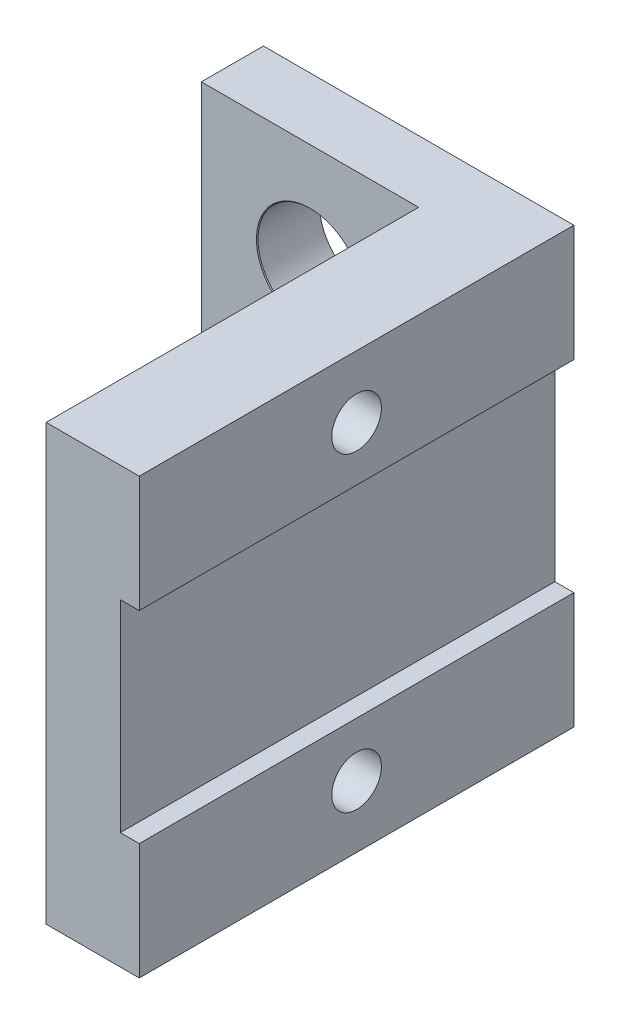
ISO-10303-21;
HEADER;
FILE_DESCRIPTION(('STEP AP214'),'2;1');
FILE_NAME('part.step','',(''),(''),'','','');
FILE_SCHEMA(('AUTOMOTIVE_DESIGN { 1 0 10303 214 1 1 1 1 }'));
ENDSEC;
DATA;
#1=APPLICATION_CONTEXT('core data for automotive mechanical design processes');
#2=APPLICATION_PROTOCOL_DEFINITION('international standard','automotive_design',2000,#1);
#3=PRODUCT_CONTEXT('',#1,'mechanical');
#4=PRODUCT('Part','Part','',(#3));
#5=PRODUCT_RELATED_PRODUCT_CATEGORY('part','',(#4));
#6=PRODUCT_DEFINITION_FORMATION('','',#4);
#7=PRODUCT_DEFINITION_CONTEXT('part definition',#1,'design');
#8=PRODUCT_DEFINITION('design','',#6,#7);
#9=PRODUCT_DEFINITION_SHAPE('','',#8);
#10=(LENGTH_UNIT() NAMED_UNIT(*) SI_UNIT(.MILLI.,.METRE.));
#11=(NAMED_UNIT(*) PLANE_ANGLE_UNIT() SI_UNIT($,.RADIAN.));
#12=(NAMED_UNIT(*) SI_UNIT($,.STERADIAN.) SOLID_ANGLE_UNIT());
#13=UNCERTAINTY_MEASURE_WITH_UNIT(LENGTH_MEASURE(1.E-05),#10,'distance_accuracy_value','');
#14=(GEOMETRIC_REPRESENTATION_CONTEXT(3) GLOBAL_UNCERTAINTY_ASSIGNED_CONTEXT((#13)) GLOBAL_UNIT_ASSIGNED_CONTEXT((#10,
#11,#12)) REPRESENTATION_CONTEXT('',''));
#15=CARTESIAN_POINT('',(0.,0.,0.));
#16=DIRECTION('',(0.,0.,1.));
#17=DIRECTION('',(1.,0.,0.));
#18=AXIS2_PLACEMENT_3D('',#15,#16,#17);
#19=CARTESIAN_POINT('',(0.,14.,0.));
#20=DIRECTION('',(-1.,0.,0.));
#21=DIRECTION('',(0.,0.,1.));
#22=AXIS2_PLACEMENT_3D('',#19,#20,#21);
#23=PLANE('',#22);
#24=CARTESIAN_POINT('',(0.,2.,7.));
#25=DIRECTION('',(1.,0.,0.));
#26=DIRECTION('',(0.,0.,-1.));
#27=AXIS2_PLACEMENT_3D('',#24,#25,#26);
#28=CIRCLE('',#27,0.799999999999988);
#29=CARTESIAN_POINT('',(0.,2.,6.20000000000001));
#30=VERTEX_POINT('',#29);
#31=EDGE_CURVE('E244',#30,#30,#28,.T.);
#32=ORIENTED_EDGE('',*,*,#31,.F.);
#33=EDGE_LOOP('',(#32));
#34=FACE_BOUND('',#33,.T.);
#35=DIRECTION('',(0.,-1.,0.));
#36=VECTOR('',#35,1.);
#37=CARTESIAN_POINT('',(0.,14.,0.));
#38=LINE('',#37,#36);
#39=CARTESIAN_POINT('',(0.,3.75,0.));
#40=VERTEX_POINT('',#39);
#41=CARTESIAN_POINT('',(0.,0.,0.));
#42=VERTEX_POINT('',#41);
#43=EDGE_CURVE('E151',#40,#42,#38,.T.);
#44=ORIENTED_EDGE('',*,*,#43,.F.);
#45=DIRECTION('',(0.,0.,1.));
#46=VECTOR('',#45,1.);
#47=CARTESIAN_POINT('',(0.,3.75,0.));
#48=LINE('',#47,#46);
#49=CARTESIAN_POINT('',(0.,3.75,14.));
#50=VERTEX_POINT('',#49);
#51=EDGE_CURVE('E172',#40,#50,#48,.T.);
#52=ORIENTED_EDGE('',*,*,#51,.T.);
#53=DIRECTION('',(0.,-1.,0.));
#54=VECTOR('',#53,1.);
#55=CARTESIAN_POINT('',(0.,14.,14.));
#56=LINE('',#55,#54);
#57=CARTESIAN_POINT('',(0.,0.,14.));
#58=VERTEX_POINT('',#57);
#59=EDGE_CURVE('E124',#50,#58,#56,.T.);
#60=ORIENTED_EDGE('',*,*,#59,.T.);
#61=DIRECTION('',(0.,0.,-1.));
#62=VECTOR('',#61,1.);
#63=CARTESIAN_POINT('',(0.,0.,0.));
#64=LINE('',#63,#62);
#65=EDGE_CURVE('E145',#58,#42,#64,.T.);
#66=ORIENTED_EDGE('',*,*,#65,.T.);
#67=EDGE_LOOP('',(#44,#52,#60,#66));
#68=FACE_BOUND('',#67,.T.);
#69=ADVANCED_FACE('F31',(#34,#68),#23,.F.);
#70=CARTESIAN_POINT('',(-10.,14.,2.));
#71=DIRECTION('',(1.,0.,0.));
#72=DIRECTION('',(0.,0.,-1.));
#73=AXIS2_PLACEMENT_3D('',#70,#71,#72);
#74=PLANE('',#73);
#75=DIRECTION('',(0.,0.,1.));
#76=VECTOR('',#75,1.);
#77=CARTESIAN_POINT('',(-10.,0.,2.));
#78=LINE('',#77,#76);
#79=CARTESIAN_POINT('',(-10.,0.,0.));
#80=VERTEX_POINT('',#79);
#81=CARTESIAN_POINT('',(-10.,0.,2.));
#82=VERTEX_POINT('',#81);
#83=EDGE_CURVE('E134',#80,#82,#78,.T.);
#84=ORIENTED_EDGE('',*,*,#83,.T.);
#85=DIRECTION('',(0.,-1.,0.));
#86=VECTOR('',#85,1.);
#87=CARTESIAN_POINT('',(-10.,14.,2.));
#88=LINE('',#87,#86);
#89=CARTESIAN_POINT('',(-10.,14.,2.));
#90=VERTEX_POINT('',#89);
#91=EDGE_CURVE('E11',#90,#82,#88,.T.);
#92=ORIENTED_EDGE('',*,*,#91,.F.);
#93=DIRECTION('',(0.,0.,1.));
#94=VECTOR('',#93,1.);
#95=CARTESIAN_POINT('',(-10.,14.,2.));
#96=LINE('',#95,#94);
#97=CARTESIAN_POINT('',(-10.,14.,0.));
#98=VERTEX_POINT('',#97);
#99=EDGE_CURVE('E149',#98,#90,#96,.T.);
#100=ORIENTED_EDGE('',*,*,#99,.F.);
#101=DIRECTION('',(0.,-1.,0.));
#102=VECTOR('',#101,1.);
#103=CARTESIAN_POINT('',(-10.,14.,0.));
#104=LINE('',#103,#102);
#105=EDGE_CURVE('E130',#98,#80,#104,.T.);
#106=ORIENTED_EDGE('',*,*,#105,.T.);
#107=EDGE_LOOP('',(#84,#92,#100,#106));
#108=FACE_BOUND('',#107,.T.);
#109=ADVANCED_FACE('F33',(#108),#74,.F.);
#110=CARTESIAN_POINT('',(-3.,14.,2.));
#111=DIRECTION('',(0.,0.,-1.));
#112=DIRECTION('',(-1.,0.,0.));
#113=AXIS2_PLACEMENT_3D('',#110,#111,#112);
#114=PLANE('',#113);
#115=CARTESIAN_POINT('',(-6.5,10.5,2.));
#116=DIRECTION('',(0.,0.,1.));
#117=DIRECTION('',(1.,0.,0.));
#118=AXIS2_PLACEMENT_3D('',#115,#116,#117);
#119=CIRCLE('',#118,1.725);
#120=CARTESIAN_POINT('',(-4.775,10.5,2.));
#121=VERTEX_POINT('',#120);
#122=EDGE_CURVE('E176',#121,#121,#119,.T.);
#123=ORIENTED_EDGE('',*,*,#122,.F.);
#124=EDGE_LOOP('',(#123));
#125=FACE_BOUND('',#124,.T.);
#126=CARTESIAN_POINT('',(-6.5,3.5,2.));
#127=DIRECTION('',(0.,0.,1.));
#128=DIRECTION('',(1.,0.,0.));
#129=AXIS2_PLACEMENT_3D('',#126,#127,#128);
#130=CIRCLE('',#129,1.725);
#131=CARTESIAN_POINT('',(-4.775,3.5,2.));
#132=VERTEX_POINT('',#131);
#133=EDGE_CURVE('E198',#132,#132,#130,.T.);
#134=ORIENTED_EDGE('',*,*,#133,.F.);
#135=EDGE_LOOP('',(#134));
#136=FACE_BOUND('',#135,.T.);
#137=DIRECTION('',(1.,0.,0.));
#138=VECTOR('',#137,1.);
#139=CARTESIAN_POINT('',(-3.,0.,2.));
#140=LINE('',#139,#138);
#141=CARTESIAN_POINT('',(-3.,0.,2.));
#142=VERTEX_POINT('',#141);
#143=EDGE_CURVE('E137',#82,#142,#140,.T.);
#144=ORIENTED_EDGE('',*,*,#143,.T.);
#145=DIRECTION('',(0.,-1.,0.));
#146=VECTOR('',#145,1.);
#147=CARTESIAN_POINT('',(-3.,14.,2.));
#148=LINE('',#147,#146);
#149=CARTESIAN_POINT('',(-3.,14.,2.));
#150=VERTEX_POINT('',#149);
#151=EDGE_CURVE('E40',#150,#142,#148,.T.);
#152=ORIENTED_EDGE('',*,*,#151,.F.);
#153=DIRECTION('',(1.,0.,0.));
#154=VECTOR('',#153,1.);
#155=CARTESIAN_POINT('',(-3.,14.,2.));
#156=LINE('',#155,#154);
#157=EDGE_CURVE('E90',#90,#150,#156,.T.);
#158=ORIENTED_EDGE('',*,*,#157,.F.);
#159=ORIENTED_EDGE('',*,*,#91,.T.);
#160=EDGE_LOOP('',(#144,#152,#158,#159));
#161=FACE_BOUND('',#160,.T.);
#162=ADVANCED_FACE('F210',(#125,#136,#161),#114,.F.);
#163=CARTESIAN_POINT('',(-3.,14.,14.));
#164=DIRECTION('',(1.,0.,0.));
#165=DIRECTION('',(0.,0.,-1.));
#166=AXIS2_PLACEMENT_3D('',#163,#164,#165);
#167=PLANE('',#166);
#168=CARTESIAN_POINT('',(-3.,12.,7.));
#169=DIRECTION('',(1.,0.,0.));
#170=DIRECTION('',(0.,0.,-1.));
#171=AXIS2_PLACEMENT_3D('',#168,#169,#170);
#172=CIRCLE('',#171,0.799999999999993);
#173=CARTESIAN_POINT('',(-3.,12.,6.20000000000001));
#174=VERTEX_POINT('',#173);
#175=EDGE_CURVE('E241',#174,#174,#172,.T.);
#176=ORIENTED_EDGE('',*,*,#175,.T.);
#177=EDGE_LOOP('',(#176));
#178=FACE_BOUND('',#177,.T.);
#179=CARTESIAN_POINT('',(-3.,2.,7.));
#180=DIRECTION('',(1.,0.,0.));
#181=DIRECTION('',(0.,0.,-1.));
#182=AXIS2_PLACEMENT_3D('',#179,#180,#181);
#183=CIRCLE('',#182,0.799999999999993);
#184=CARTESIAN_POINT('',(-3.,2.,6.20000000000001));
#185=VERTEX_POINT('',#184);
#186=EDGE_CURVE('E35',#185,#185,#183,.T.);
#187=ORIENTED_EDGE('',*,*,#186,.T.);
#188=EDGE_LOOP('',(#187));
#189=FACE_BOUND('',#188,.T.);
#190=DIRECTION('',(0.,0.,1.));
#191=VECTOR('',#190,1.);
#192=CARTESIAN_POINT('',(-3.,0.,14.));
#193=LINE('',#192,#191);
#194=CARTESIAN_POINT('',(-3.,0.,14.));
#195=VERTEX_POINT('',#194);
#196=EDGE_CURVE('E140',#142,#195,#193,.T.);
#197=ORIENTED_EDGE('',*,*,#196,.T.);
#198=DIRECTION('',(0.,-1.,0.));
#199=VECTOR('',#198,1.);
#200=CARTESIAN_POINT('',(-3.,14.,14.));
#201=LINE('',#200,#199);
#202=CARTESIAN_POINT('',(-3.,14.,14.));
#203=VERTEX_POINT('',#202);
#204=EDGE_CURVE('E123',#203,#195,#201,.T.);
#205=ORIENTED_EDGE('',*,*,#204,.F.);
#206=DIRECTION('',(0.,0.,1.));
#207=VECTOR('',#206,1.);
#208=CARTESIAN_POINT('',(-3.,14.,14.));
#209=LINE('',#208,#207);
#210=EDGE_CURVE('E107',#150,#203,#209,.T.);
#211=ORIENTED_EDGE('',*,*,#210,.F.);
#212=ORIENTED_EDGE('',*,*,#151,.T.);
#213=EDGE_LOOP('',(#197,#205,#211,#212));
#214=FACE_BOUND('',#213,.T.);
#215=ADVANCED_FACE('F157',(#178,#189,#214),#167,.F.);
#216=CARTESIAN_POINT('',(0.,14.,14.));
#217=DIRECTION('',(0.,0.,-1.));
#218=DIRECTION('',(-1.,0.,0.));
#219=AXIS2_PLACEMENT_3D('',#216,#217,#218);
#220=PLANE('',#219);
#221=ORIENTED_EDGE('',*,*,#59,.F.);
#222=DIRECTION('',(1.,0.,0.));
#223=VECTOR('',#222,1.);
#224=CARTESIAN_POINT('',(0.,3.75,14.));
#225=LINE('',#224,#223);
#226=CARTESIAN_POINT('',(-0.609999999999999,3.75,14.));
#227=VERTEX_POINT('',#226);
#228=EDGE_CURVE('E166',#227,#50,#225,.T.);
#229=ORIENTED_EDGE('',*,*,#228,.F.);
#230=DIRECTION('',(0.,-1.,0.));
#231=VECTOR('',#230,1.);
#232=CARTESIAN_POINT('',(-0.610000000000001,10.25,14.));
#233=LINE('',#232,#231);
#234=CARTESIAN_POINT('',(-0.610000000000001,10.25,14.));
#235=VERTEX_POINT('',#234);
#236=EDGE_CURVE('E254',#235,#227,#233,.T.);
#237=ORIENTED_EDGE('',*,*,#236,.F.);
#238=DIRECTION('',(-1.,0.,0.));
#239=VECTOR('',#238,1.);
#240=CARTESIAN_POINT('',(0.,10.25,14.));
#241=LINE('',#240,#239);
#242=CARTESIAN_POINT('',(0.,10.25,14.));
#243=VERTEX_POINT('',#242);
#244=EDGE_CURVE('E120',#243,#235,#241,.T.);
#245=ORIENTED_EDGE('',*,*,#244,.F.);
#246=CARTESIAN_POINT('',(0.,14.,14.));
#247=VERTEX_POINT('',#246);
#248=EDGE_CURVE('E114',#247,#243,#56,.T.);
#249=ORIENTED_EDGE('',*,*,#248,.F.);
#250=DIRECTION('',(1.,0.,0.));
#251=VECTOR('',#250,1.);
#252=CARTESIAN_POINT('',(0.,14.,14.));
#253=LINE('',#252,#251);
#254=EDGE_CURVE('E100',#203,#247,#253,.T.);
#255=ORIENTED_EDGE('',*,*,#254,.F.);
#256=ORIENTED_EDGE('',*,*,#204,.T.);
#257=DIRECTION('',(1.,0.,0.));
#258=VECTOR('',#257,1.);
#259=CARTESIAN_POINT('',(0.,0.,14.));
#260=LINE('',#259,#258);
#261=EDGE_CURVE('E142',#195,#58,#260,.T.);
#262=ORIENTED_EDGE('',*,*,#261,.T.);
#263=EDGE_LOOP('',(#221,#229,#237,#245,#249,#255,#256,#262));
#264=FACE_BOUND('',#263,.T.);
#265=ADVANCED_FACE('F116',(#264),#220,.F.);
#266=CARTESIAN_POINT('',(0.,12.,7.));
#267=DIRECTION('',(1.,0.,0.));
#268=DIRECTION('',(0.,0.,-1.));
#269=AXIS2_PLACEMENT_3D('',#266,#267,#268);
#270=CIRCLE('',#269,0.799999999999988);
#271=CARTESIAN_POINT('',(0.,12.,6.20000000000001));
#272=VERTEX_POINT('',#271);
#273=EDGE_CURVE('E239',#272,#272,#270,.T.);
#274=ORIENTED_EDGE('',*,*,#273,.F.);
#275=EDGE_LOOP('',(#274));
#276=FACE_BOUND('',#275,.T.);
#277=ORIENTED_EDGE('',*,*,#248,.T.);
#278=DIRECTION('',(0.,0.,1.));
#279=VECTOR('',#278,1.);
#280=CARTESIAN_POINT('',(0.,10.25,0.));
#281=LINE('',#280,#279);
#282=CARTESIAN_POINT('',(0.,10.25,0.));
#283=VERTEX_POINT('',#282);
#284=EDGE_CURVE('E189',#283,#243,#281,.T.);
#285=ORIENTED_EDGE('',*,*,#284,.F.);
#286=CARTESIAN_POINT('',(0.,14.,0.));
#287=VERTEX_POINT('',#286);
#288=EDGE_CURVE('E128',#287,#283,#38,.T.);
#289=ORIENTED_EDGE('',*,*,#288,.F.);
#290=DIRECTION('',(0.,0.,-1.));
#291=VECTOR('',#290,1.);
#292=CARTESIAN_POINT('',(0.,14.,0.));
#293=LINE('',#292,#291);
#294=EDGE_CURVE('E104',#247,#287,#293,.T.);
#295=ORIENTED_EDGE('',*,*,#294,.F.);
#296=EDGE_LOOP('',(#277,#285,#289,#295));
#297=FACE_BOUND('',#296,.T.);
#298=ADVANCED_FACE('F126',(#276,#297),#23,.F.);
#299=CARTESIAN_POINT('',(-10.,14.,0.));
#300=DIRECTION('',(0.,0.,1.));
#301=DIRECTION('',(1.,0.,0.));
#302=AXIS2_PLACEMENT_3D('',#299,#300,#301);
#303=PLANE('',#302);
#304=CARTESIAN_POINT('',(-6.5,10.5,0.));
#305=DIRECTION('',(0.,0.,1.));
#306=DIRECTION('',(1.,0.,0.));
#307=AXIS2_PLACEMENT_3D('',#304,#305,#306);
#308=CIRCLE('',#307,1.7);
#309=CARTESIAN_POINT('',(-4.8,10.5,0.));
#310=VERTEX_POINT('',#309);
#311=EDGE_CURVE('E195',#310,#310,#308,.T.);
#312=ORIENTED_EDGE('',*,*,#311,.T.);
#313=EDGE_LOOP('',(#312));
#314=FACE_BOUND('',#313,.T.);
#315=CARTESIAN_POINT('',(-6.5,3.5,0.));
#316=DIRECTION('',(0.,0.,1.));
#317=DIRECTION('',(1.,0.,0.));
#318=AXIS2_PLACEMENT_3D('',#315,#316,#317);
#319=CIRCLE('',#318,1.7);
#320=CARTESIAN_POINT('',(-4.8,3.5,0.));
#321=VERTEX_POINT('',#320);
#322=EDGE_CURVE('E138',#321,#321,#319,.T.);
#323=ORIENTED_EDGE('',*,*,#322,.T.);
#324=EDGE_LOOP('',(#323));
#325=FACE_BOUND('',#324,.T.);
#326=DIRECTION('',(0.,-1.,0.));
#327=VECTOR('',#326,1.);
#328=CARTESIAN_POINT('',(-0.610000000000001,10.25,0.));
#329=LINE('',#328,#327);
#330=CARTESIAN_POINT('',(-0.610000000000001,10.25,0.));
#331=VERTEX_POINT('',#330);
#332=CARTESIAN_POINT('',(-0.609999999999999,3.75,0.));
#333=VERTEX_POINT('',#332);
#334=EDGE_CURVE('E47',#331,#333,#329,.T.);
#335=ORIENTED_EDGE('',*,*,#334,.T.);
#336=DIRECTION('',(1.,0.,0.));
#337=VECTOR('',#336,1.);
#338=CARTESIAN_POINT('',(0.,3.75,0.));
#339=LINE('',#338,#337);
#340=EDGE_CURVE('E191',#333,#40,#339,.T.);
#341=ORIENTED_EDGE('',*,*,#340,.T.);
#342=ORIENTED_EDGE('',*,*,#43,.T.);
#343=DIRECTION('',(-1.,0.,0.));
#344=VECTOR('',#343,1.);
#345=CARTESIAN_POINT('',(-10.,0.,0.));
#346=LINE('',#345,#344);
#347=EDGE_CURVE('E82',#42,#80,#346,.T.);
#348=ORIENTED_EDGE('',*,*,#347,.T.);
#349=ORIENTED_EDGE('',*,*,#105,.F.);
#350=DIRECTION('',(-1.,0.,0.));
#351=VECTOR('',#350,1.);
#352=CARTESIAN_POINT('',(-10.,14.,0.));
#353=LINE('',#352,#351);
#354=EDGE_CURVE('E56',#287,#98,#353,.T.);
#355=ORIENTED_EDGE('',*,*,#354,.F.);
#356=ORIENTED_EDGE('',*,*,#288,.T.);
#357=DIRECTION('',(-1.,0.,0.));
#358=VECTOR('',#357,1.);
#359=CARTESIAN_POINT('',(0.,10.25,0.));
#360=LINE('',#359,#358);
#361=EDGE_CURVE('E249',#283,#331,#360,.T.);
#362=ORIENTED_EDGE('',*,*,#361,.T.);
#363=EDGE_LOOP('',(#335,#341,#342,#348,#349,#355,#356,#362));
#364=FACE_BOUND('',#363,.T.);
#365=ADVANCED_FACE('F230',(#314,#325,#364),#303,.F.);
#366=CARTESIAN_POINT('',(-10.,14.,0.));
#367=DIRECTION('',(0.,-1.,0.));
#368=DIRECTION('',(0.,0.,-1.));
#369=AXIS2_PLACEMENT_3D('',#366,#367,#368);
#370=PLANE('',#369);
#371=ORIENTED_EDGE('',*,*,#99,.T.);
#372=ORIENTED_EDGE('',*,*,#157,.T.);
#373=ORIENTED_EDGE('',*,*,#210,.T.);
#374=ORIENTED_EDGE('',*,*,#254,.T.);
#375=ORIENTED_EDGE('',*,*,#294,.T.);
#376=ORIENTED_EDGE('',*,*,#354,.T.);
#377=EDGE_LOOP('',(#371,#372,#373,#374,#375,#376));
#378=FACE_BOUND('',#377,.T.);
#379=ADVANCED_FACE('F102',(#378),#370,.F.);
#380=CARTESIAN_POINT('',(-10.,0.,0.));
#381=DIRECTION('',(0.,-1.,0.));
#382=DIRECTION('',(0.,0.,-1.));
#383=AXIS2_PLACEMENT_3D('',#380,#381,#382);
#384=PLANE('',#383);
#385=ORIENTED_EDGE('',*,*,#83,.F.);
#386=ORIENTED_EDGE('',*,*,#347,.F.);
#387=ORIENTED_EDGE('',*,*,#65,.F.);
#388=ORIENTED_EDGE('',*,*,#261,.F.);
#389=ORIENTED_EDGE('',*,*,#196,.F.);
#390=ORIENTED_EDGE('',*,*,#143,.F.);
#391=EDGE_LOOP('',(#385,#386,#387,#388,#389,#390));
#392=FACE_BOUND('',#391,.T.);
#393=ADVANCED_FACE('F161',(#392),#384,.T.);
#394=CARTESIAN_POINT('',(-6.5,3.5,2.));
#395=DIRECTION('',(0.,0.,1.));
#396=DIRECTION('',(1.,0.,0.));
#397=AXIS2_PLACEMENT_3D('',#394,#395,#396);
#398=CYLINDRICAL_SURFACE('',#397,1.7);
#399=ORIENTED_EDGE('',*,*,#322,.F.);
#400=EDGE_LOOP('',(#399));
#401=FACE_BOUND('',#400,.T.);
#402=CARTESIAN_POINT('',(-6.5,3.5,1.975));
#403=DIRECTION('',(0.,0.,1.));
#404=DIRECTION('',(1.,0.,0.));
#405=AXIS2_PLACEMENT_3D('',#402,#403,#404);
#406=CIRCLE('',#405,1.7);
#407=CARTESIAN_POINT('',(-4.8,3.5,1.975));
#408=VERTEX_POINT('',#407);
#409=EDGE_CURVE('E201',#408,#408,#406,.T.);
#410=ORIENTED_EDGE('',*,*,#409,.T.);
#411=EDGE_LOOP('',(#410));
#412=FACE_BOUND('',#411,.T.);
#413=ADVANCED_FACE('F292',(#401,#412),#398,.F.);
#414=CARTESIAN_POINT('',(-6.5,3.5,2.));
#415=DIRECTION('',(0.,0.,1.));
#416=DIRECTION('',(1.,0.,0.));
#417=AXIS2_PLACEMENT_3D('',#414,#415,#416);
#418=CONICAL_SURFACE('',#417,1.725,0.785398163397422);
#419=ORIENTED_EDGE('',*,*,#409,.F.);
#420=EDGE_LOOP('',(#419));
#421=FACE_BOUND('',#420,.T.);
#422=ORIENTED_EDGE('',*,*,#133,.T.);
#423=EDGE_LOOP('',(#422));
#424=FACE_BOUND('',#423,.T.);
#425=ADVANCED_FACE('F288',(#421,#424),#418,.F.);
#426=CARTESIAN_POINT('',(-6.5,10.5,2.));
#427=DIRECTION('',(0.,0.,1.));
#428=DIRECTION('',(1.,0.,0.));
#429=AXIS2_PLACEMENT_3D('',#426,#427,#428);
#430=CYLINDRICAL_SURFACE('',#429,1.7);
#431=ORIENTED_EDGE('',*,*,#311,.F.);
#432=EDGE_LOOP('',(#431));
#433=FACE_BOUND('',#432,.T.);
#434=CARTESIAN_POINT('',(-6.5,10.5,1.975));
#435=DIRECTION('',(0.,0.,1.));
#436=DIRECTION('',(1.,0.,0.));
#437=AXIS2_PLACEMENT_3D('',#434,#435,#436);
#438=CIRCLE('',#437,1.7);
#439=CARTESIAN_POINT('',(-4.8,10.5,1.975));
#440=VERTEX_POINT('',#439);
#441=EDGE_CURVE('E180',#440,#440,#438,.T.);
#442=ORIENTED_EDGE('',*,*,#441,.T.);
#443=EDGE_LOOP('',(#442));
#444=FACE_BOUND('',#443,.T.);
#445=ADVANCED_FACE('F284',(#433,#444),#430,.F.);
#446=CARTESIAN_POINT('',(-6.5,10.5,2.));
#447=DIRECTION('',(0.,0.,1.));
#448=DIRECTION('',(1.,0.,0.));
#449=AXIS2_PLACEMENT_3D('',#446,#447,#448);
#450=CONICAL_SURFACE('',#449,1.725,0.785398163397422);
#451=ORIENTED_EDGE('',*,*,#441,.F.);
#452=EDGE_LOOP('',(#451));
#453=FACE_BOUND('',#452,.T.);
#454=ORIENTED_EDGE('',*,*,#122,.T.);
#455=EDGE_LOOP('',(#454));
#456=FACE_BOUND('',#455,.T.);
#457=ADVANCED_FACE('F281',(#453,#456),#450,.F.);
#458=CARTESIAN_POINT('',(0.,3.75,0.));
#459=DIRECTION('',(0.,-1.,0.));
#460=DIRECTION('',(0.,0.,-1.));
#461=AXIS2_PLACEMENT_3D('',#458,#459,#460);
#462=PLANE('',#461);
#463=ORIENTED_EDGE('',*,*,#228,.T.);
#464=ORIENTED_EDGE('',*,*,#51,.F.);
#465=ORIENTED_EDGE('',*,*,#340,.F.);
#466=DIRECTION('',(0.,0.,1.));
#467=VECTOR('',#466,1.);
#468=CARTESIAN_POINT('',(-0.609999999999999,3.75,0.));
#469=LINE('',#468,#467);
#470=EDGE_CURVE('E177',#333,#227,#469,.T.);
#471=ORIENTED_EDGE('',*,*,#470,.T.);
#472=EDGE_LOOP('',(#463,#464,#465,#471));
#473=FACE_BOUND('',#472,.T.);
#474=ADVANCED_FACE('F256',(#473),#462,.F.);
#475=CARTESIAN_POINT('',(-0.610000000000001,10.25,0.));
#476=DIRECTION('',(-1.,0.,0.));
#477=DIRECTION('',(0.,-1.,0.));
#478=AXIS2_PLACEMENT_3D('',#475,#476,#477);
#479=PLANE('',#478);
#480=ORIENTED_EDGE('',*,*,#236,.T.);
#481=ORIENTED_EDGE('',*,*,#470,.F.);
#482=ORIENTED_EDGE('',*,*,#334,.F.);
#483=DIRECTION('',(0.,0.,1.));
#484=VECTOR('',#483,1.);
#485=CARTESIAN_POINT('',(-0.610000000000001,10.25,0.));
#486=LINE('',#485,#484);
#487=EDGE_CURVE('E183',#331,#235,#486,.T.);
#488=ORIENTED_EDGE('',*,*,#487,.T.);
#489=EDGE_LOOP('',(#480,#481,#482,#488));
#490=FACE_BOUND('',#489,.T.);
#491=ADVANCED_FACE('F259',(#490),#479,.F.);
#492=CARTESIAN_POINT('',(0.,10.25,0.));
#493=DIRECTION('',(0.,1.,0.));
#494=DIRECTION('',(0.,0.,1.));
#495=AXIS2_PLACEMENT_3D('',#492,#493,#494);
#496=PLANE('',#495);
#497=ORIENTED_EDGE('',*,*,#244,.T.);
#498=ORIENTED_EDGE('',*,*,#487,.F.);
#499=ORIENTED_EDGE('',*,*,#361,.F.);
#500=ORIENTED_EDGE('',*,*,#284,.T.);
#501=EDGE_LOOP('',(#497,#498,#499,#500));
#502=FACE_BOUND('',#501,.T.);
#503=ADVANCED_FACE('F267',(#502),#496,.F.);
#504=CARTESIAN_POINT('',(0.,2.,7.));
#505=DIRECTION('',(1.,0.,0.));
#506=DIRECTION('',(0.,0.,-1.));
#507=AXIS2_PLACEMENT_3D('',#504,#505,#506);
#508=CYLINDRICAL_SURFACE('',#507,0.799999999999993);
#509=ORIENTED_EDGE('',*,*,#31,.T.);
#510=EDGE_LOOP('',(#509));
#511=FACE_BOUND('',#510,.T.);
#512=ORIENTED_EDGE('',*,*,#186,.F.);
#513=EDGE_LOOP('',(#512));
#514=FACE_BOUND('',#513,.T.);
#515=ADVANCED_FACE('F269',(#511,#514),#508,.F.);
#516=CARTESIAN_POINT('',(0.,12.,7.));
#517=DIRECTION('',(1.,0.,0.));
#518=DIRECTION('',(0.,0.,-1.));
#519=AXIS2_PLACEMENT_3D('',#516,#517,#518);
#520=CYLINDRICAL_SURFACE('',#519,0.799999999999993);
#521=ORIENTED_EDGE('',*,*,#273,.T.);
#522=EDGE_LOOP('',(#521));
#523=FACE_BOUND('',#522,.T.);
#524=ORIENTED_EDGE('',*,*,#175,.F.);
#525=EDGE_LOOP('',(#524));
#526=FACE_BOUND('',#525,.T.);
#527=ADVANCED_FACE('F275',(#523,#526),#520,.F.);
#528=CLOSED_SHELL('',(#69,#109,#162,#215,#265,#298,#365,#379,#393,#413,#425,#445,#457,#474,#491,
#503,#515,#527));
#529=MANIFOLD_SOLID_BREP('B2',#528);
#530=ADVANCED_BREP_SHAPE_REPRESENTATION('',(#18,#529),#14);
#531=SHAPE_DEFINITION_REPRESENTATION(#9,#530);
ENDSEC;
END-ISO-10303-21;
